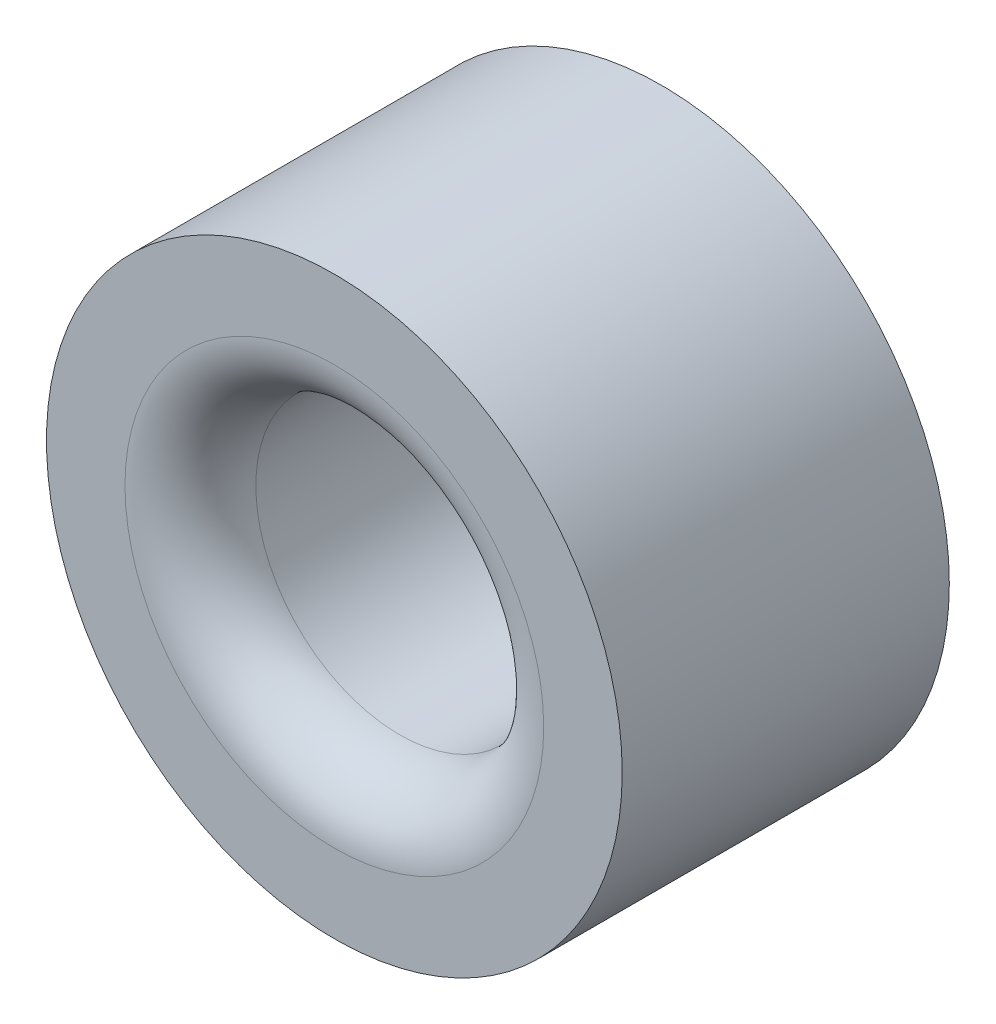
ISO-10303-21;
HEADER;
FILE_DESCRIPTION(('STEP AP214'),'2;1');
FILE_NAME('part.step','',(''),(''),'','','');
FILE_SCHEMA(('AUTOMOTIVE_DESIGN { 1 0 10303 214 1 1 1 1 }'));
ENDSEC;
DATA;
#1=APPLICATION_CONTEXT('core data for automotive mechanical design processes');
#2=APPLICATION_PROTOCOL_DEFINITION('international standard','automotive_design',2000,#1);
#3=PRODUCT_CONTEXT('',#1,'mechanical');
#4=PRODUCT('Part','Part','',(#3));
#5=PRODUCT_RELATED_PRODUCT_CATEGORY('part','',(#4));
#6=PRODUCT_DEFINITION_FORMATION('','',#4);
#7=PRODUCT_DEFINITION_CONTEXT('part definition',#1,'design');
#8=PRODUCT_DEFINITION('design','',#6,#7);
#9=PRODUCT_DEFINITION_SHAPE('','',#8);
#10=(LENGTH_UNIT() NAMED_UNIT(*) SI_UNIT(.MILLI.,.METRE.));
#11=(NAMED_UNIT(*) PLANE_ANGLE_UNIT() SI_UNIT($,.RADIAN.));
#12=(NAMED_UNIT(*) SI_UNIT($,.STERADIAN.) SOLID_ANGLE_UNIT());
#13=UNCERTAINTY_MEASURE_WITH_UNIT(LENGTH_MEASURE(1.E-05),#10,'distance_accuracy_value','');
#14=(GEOMETRIC_REPRESENTATION_CONTEXT(3) GLOBAL_UNCERTAINTY_ASSIGNED_CONTEXT((#13)) GLOBAL_UNIT_ASSIGNED_CONTEXT((#10,
#11,#12)) REPRESENTATION_CONTEXT('',''));
#15=CARTESIAN_POINT('',(0.,0.,0.));
#16=DIRECTION('',(0.,0.,1.));
#17=DIRECTION('',(1.,0.,0.));
#18=AXIS2_PLACEMENT_3D('',#15,#16,#17);
#19=CARTESIAN_POINT('',(0.,0.,3.175));
#20=DIRECTION('',(0.,0.,1.));
#21=DIRECTION('',(1.,0.,0.));
#22=AXIS2_PLACEMENT_3D('',#19,#20,#21);
#23=PLANE('',#22);
#24=CARTESIAN_POINT('',(0.,0.,3.175));
#25=DIRECTION('',(0.,0.,1.));
#26=DIRECTION('',(1.,0.,0.));
#27=AXIS2_PLACEMENT_3D('',#24,#25,#26);
#28=CIRCLE('',#27,2.032);
#29=CARTESIAN_POINT('',(2.032,0.,3.175));
#30=VERTEX_POINT('',#29);
#31=EDGE_CURVE('E10',#30,#30,#28,.F.);
#32=ORIENTED_EDGE('',*,*,#31,.T.);
#33=EDGE_LOOP('',(#32));
#34=FACE_BOUND('',#33,.T.);
#35=CARTESIAN_POINT('',(0.,0.,3.175));
#36=DIRECTION('',(0.,0.,1.));
#37=DIRECTION('',(1.,0.,0.));
#38=AXIS2_PLACEMENT_3D('',#35,#36,#37);
#39=CIRCLE('',#38,2.794);
#40=CARTESIAN_POINT('',(2.794,0.,3.175));
#41=VERTEX_POINT('',#40);
#42=EDGE_CURVE('E42',#41,#41,#39,.T.);
#43=ORIENTED_EDGE('',*,*,#42,.T.);
#44=EDGE_LOOP('',(#43));
#45=FACE_BOUND('',#44,.T.);
#46=ADVANCED_FACE('F31',(#34,#45),#23,.T.);
#47=CARTESIAN_POINT('',(0.,0.,0.));
#48=DIRECTION('',(0.,0.,1.));
#49=DIRECTION('',(1.,0.,0.));
#50=AXIS2_PLACEMENT_3D('',#47,#48,#49);
#51=PLANE('',#50);
#52=CARTESIAN_POINT('',(0.,0.,0.));
#53=DIRECTION('',(0.,0.,1.));
#54=DIRECTION('',(1.,0.,0.));
#55=AXIS2_PLACEMENT_3D('',#52,#53,#54);
#56=CIRCLE('',#55,2.794);
#57=CARTESIAN_POINT('',(2.794,0.,0.));
#58=VERTEX_POINT('',#57);
#59=EDGE_CURVE('E46',#58,#58,#56,.T.);
#60=ORIENTED_EDGE('',*,*,#59,.F.);
#61=EDGE_LOOP('',(#60));
#62=FACE_BOUND('',#61,.T.);
#63=CARTESIAN_POINT('',(0.,0.,0.));
#64=DIRECTION('',(0.,0.,1.));
#65=DIRECTION('',(1.,0.,0.));
#66=AXIS2_PLACEMENT_3D('',#63,#64,#65);
#67=CIRCLE('',#66,1.397);
#68=CARTESIAN_POINT('',(1.397,0.,0.));
#69=VERTEX_POINT('',#68);
#70=EDGE_CURVE('E50',#69,#69,#67,.T.);
#71=ORIENTED_EDGE('',*,*,#70,.T.);
#72=EDGE_LOOP('',(#71));
#73=FACE_BOUND('',#72,.T.);
#74=ADVANCED_FACE('F55',(#62,#73),#51,.F.);
#75=CARTESIAN_POINT('',(0.,0.,3.175));
#76=DIRECTION('',(0.,0.,-1.));
#77=DIRECTION('',(-1.,0.,0.));
#78=AXIS2_PLACEMENT_3D('',#75,#76,#77);
#79=CYLINDRICAL_SURFACE('',#78,2.794);
#80=ORIENTED_EDGE('',*,*,#42,.F.);
#81=EDGE_LOOP('',(#80));
#82=FACE_BOUND('',#81,.T.);
#83=ORIENTED_EDGE('',*,*,#59,.T.);
#84=EDGE_LOOP('',(#83));
#85=FACE_BOUND('',#84,.T.);
#86=ADVANCED_FACE('F59',(#82,#85),#79,.T.);
#87=CARTESIAN_POINT('',(0.,0.,3.175));
#88=DIRECTION('',(0.,0.,-1.));
#89=DIRECTION('',(-1.,0.,0.));
#90=AXIS2_PLACEMENT_3D('',#87,#88,#89);
#91=CYLINDRICAL_SURFACE('',#90,1.397);
#92=CARTESIAN_POINT('',(0.,0.,2.54));
#93=DIRECTION('',(0.,0.,1.));
#94=DIRECTION('',(1.,0.,0.));
#95=AXIS2_PLACEMENT_3D('',#92,#93,#94);
#96=CIRCLE('',#95,1.397);
#97=CARTESIAN_POINT('',(1.397,0.,2.54));
#98=VERTEX_POINT('',#97);
#99=EDGE_CURVE('E38',#98,#98,#96,.T.);
#100=ORIENTED_EDGE('',*,*,#99,.T.);
#101=EDGE_LOOP('',(#100));
#102=FACE_BOUND('',#101,.T.);
#103=ORIENTED_EDGE('',*,*,#70,.F.);
#104=EDGE_LOOP('',(#103));
#105=FACE_BOUND('',#104,.T.);
#106=ADVANCED_FACE('F57',(#102,#105),#91,.F.);
#107=CARTESIAN_POINT('',(0.,0.,2.54));
#108=DIRECTION('',(0.,0.,1.));
#109=DIRECTION('',(1.,0.,0.));
#110=AXIS2_PLACEMENT_3D('',#107,#108,#109);
#111=TOROIDAL_SURFACE('',#110,2.032,0.635);
#112=ORIENTED_EDGE('',*,*,#31,.F.);
#113=EDGE_LOOP('',(#112));
#114=FACE_BOUND('',#113,.T.);
#115=ORIENTED_EDGE('',*,*,#99,.F.);
#116=EDGE_LOOP('',(#115));
#117=FACE_BOUND('',#116,.T.);
#118=ADVANCED_FACE('F33',(#114,#117),#111,.T.);
#119=CLOSED_SHELL('',(#46,#74,#86,#106,#118));
#120=MANIFOLD_SOLID_BREP('B2',#119);
#121=ADVANCED_BREP_SHAPE_REPRESENTATION('',(#18,#120),#14);
#122=SHAPE_DEFINITION_REPRESENTATION(#9,#121);
ENDSEC;
END-ISO-10303-21;
